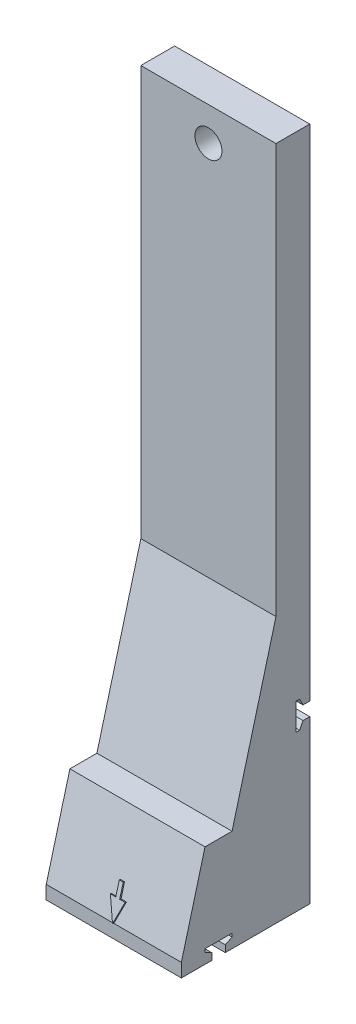
ISO-10303-21;
HEADER;
FILE_DESCRIPTION(('STEP AP214'),'2;1');
FILE_NAME('part.step','',(''),(''),'','','');
FILE_SCHEMA(('AUTOMOTIVE_DESIGN { 1 0 10303 214 1 1 1 1 }'));
ENDSEC;
DATA;
#1=APPLICATION_CONTEXT('core data for automotive mechanical design processes');
#2=APPLICATION_PROTOCOL_DEFINITION('international standard','automotive_design',2000,#1);
#3=PRODUCT_CONTEXT('',#1,'mechanical');
#4=PRODUCT('Part','Part','',(#3));
#5=PRODUCT_RELATED_PRODUCT_CATEGORY('part','',(#4));
#6=PRODUCT_DEFINITION_FORMATION('','',#4);
#7=PRODUCT_DEFINITION_CONTEXT('part definition',#1,'design');
#8=PRODUCT_DEFINITION('design','',#6,#7);
#9=PRODUCT_DEFINITION_SHAPE('','',#8);
#10=(LENGTH_UNIT() NAMED_UNIT(*) SI_UNIT(.MILLI.,.METRE.));
#11=(NAMED_UNIT(*) PLANE_ANGLE_UNIT() SI_UNIT($,.RADIAN.));
#12=(NAMED_UNIT(*) SI_UNIT($,.STERADIAN.) SOLID_ANGLE_UNIT());
#13=UNCERTAINTY_MEASURE_WITH_UNIT(LENGTH_MEASURE(1.E-05),#10,'distance_accuracy_value','');
#14=(GEOMETRIC_REPRESENTATION_CONTEXT(3) GLOBAL_UNCERTAINTY_ASSIGNED_CONTEXT((#13)) GLOBAL_UNIT_ASSIGNED_CONTEXT((#10,
#11,#12)) REPRESENTATION_CONTEXT('',''));
#15=CARTESIAN_POINT('',(0.,0.,0.));
#16=DIRECTION('',(0.,0.,1.));
#17=DIRECTION('',(1.,0.,0.));
#18=AXIS2_PLACEMENT_3D('',#15,#16,#17);
#19=CARTESIAN_POINT('',(1250.,60.,200.));
#20=DIRECTION('',(0.,-0.258819045102525,-0.965925826289067));
#21=DIRECTION('',(0.,0.965925826289067,-0.258819045102525));
#22=AXIS2_PLACEMENT_3D('',#19,#20,#21);
#23=PLANE('',#22);
#24=DIRECTION('',(0.342020143325665,0.907673371190369,-0.243210346801698));
#25=VECTOR('',#24,1.);
#26=CARTESIAN_POINT('',(1205.45955351399,74.488887394336,196.117714323462));
#27=LINE('',#26,#25);
#28=CARTESIAN_POINT('',(1200.,60.,200.));
#29=VERTEX_POINT('',#28);
#30=CARTESIAN_POINT('',(1205.45955351399,74.488887394336,196.117714323462));
#31=VERTEX_POINT('',#30);
#32=EDGE_CURVE('E261',#29,#31,#27,.T.);
#33=ORIENTED_EDGE('',*,*,#32,.F.);
#34=DIRECTION('',(-1.,0.,0.));
#35=VECTOR('',#34,1.);
#36=CARTESIAN_POINT('',(1250.,60.,200.));
#37=LINE('',#36,#35);
#38=CARTESIAN_POINT('',(1250.,60.,200.));
#39=VERTEX_POINT('',#38);
#40=EDGE_CURVE('E376',#39,#29,#37,.T.);
#41=ORIENTED_EDGE('',*,*,#40,.F.);
#42=DIRECTION('',(0.,-0.965925826289067,0.258819045102525));
#43=VECTOR('',#42,1.);
#44=CARTESIAN_POINT('',(1250.,60.,200.));
#45=LINE('',#44,#43);
#46=CARTESIAN_POINT('',(1250.,125.310889132454,182.5));
#47=VERTEX_POINT('',#46);
#48=EDGE_CURVE('E321',#47,#39,#45,.T.);
#49=ORIENTED_EDGE('',*,*,#48,.F.);
#50=DIRECTION('',(-1.,0.,0.));
#51=VECTOR('',#50,1.);
#52=CARTESIAN_POINT('',(1250.,125.310889132454,182.5));
#53=LINE('',#52,#51);
#54=CARTESIAN_POINT('',(1150.,125.310889132454,182.5));
#55=VERTEX_POINT('',#54);
#56=EDGE_CURVE('E378',#47,#55,#53,.T.);
#57=ORIENTED_EDGE('',*,*,#56,.T.);
#58=DIRECTION('',(0.,-0.965925826289067,0.258819045102525));
#59=VECTOR('',#58,1.);
#60=CARTESIAN_POINT('',(1150.,60.,200.));
#61=LINE('',#60,#59);
#62=CARTESIAN_POINT('',(1150.,60.,200.));
#63=VERTEX_POINT('',#62);
#64=EDGE_CURVE('E369',#55,#63,#61,.T.);
#65=ORIENTED_EDGE('',*,*,#64,.T.);
#66=EDGE_CURVE('E375',#29,#63,#37,.T.);
#67=ORIENTED_EDGE('',*,*,#66,.F.);
#68=DIRECTION('',(0.342020143325665,-0.907673371190369,0.243210346801698));
#69=VECTOR('',#68,1.);
#70=CARTESIAN_POINT('',(1200.,60.,200.));
#71=LINE('',#70,#69);
#72=CARTESIAN_POINT('',(1194.54044648601,74.4888873943358,196.117714323462));
#73=VERTEX_POINT('',#72);
#74=EDGE_CURVE('E258',#73,#29,#71,.T.);
#75=ORIENTED_EDGE('',*,*,#74,.F.);
#76=DIRECTION('',(-1.,0.,0.));
#77=VECTOR('',#76,1.);
#78=CARTESIAN_POINT('',(1194.54044648601,74.488887394336,196.117714323462));
#79=LINE('',#78,#77);
#80=CARTESIAN_POINT('',(1198.54044648601,74.488887394336,196.117714323462));
#81=VERTEX_POINT('',#80);
#82=EDGE_CURVE('E942',#81,#73,#79,.T.);
#83=ORIENTED_EDGE('',*,*,#82,.F.);
#84=DIRECTION('',(0.,-0.965925826289067,0.258819045102526));
#85=VECTOR('',#84,1.);
#86=CARTESIAN_POINT('',(1198.54044648601,74.488887394336,196.117714323462));
#87=LINE('',#86,#85);
#88=CARTESIAN_POINT('',(1198.54044648601,84.1481456572266,193.529523872437));
#89=VERTEX_POINT('',#88);
#90=EDGE_CURVE('E939',#89,#81,#87,.T.);
#91=ORIENTED_EDGE('',*,*,#90,.F.);
#92=DIRECTION('',(-1.,0.,0.));
#93=VECTOR('',#92,1.);
#94=CARTESIAN_POINT('',(1198.54044648601,84.1481456572267,193.529523872437));
#95=LINE('',#94,#93);
#96=CARTESIAN_POINT('',(1201.45955351399,84.1481456572267,193.529523872437));
#97=VERTEX_POINT('',#96);
#98=EDGE_CURVE('E936',#97,#89,#95,.T.);
#99=ORIENTED_EDGE('',*,*,#98,.F.);
#100=DIRECTION('',(0.,0.965925826289067,-0.258819045102526));
#101=VECTOR('',#100,1.);
#102=CARTESIAN_POINT('',(1201.45955351399,84.1481456572267,193.529523872437));
#103=LINE('',#102,#101);
#104=CARTESIAN_POINT('',(1201.45955351399,74.488887394336,196.117714323462));
#105=VERTEX_POINT('',#104);
#106=EDGE_CURVE('E58',#105,#97,#103,.T.);
#107=ORIENTED_EDGE('',*,*,#106,.F.);
#108=DIRECTION('',(-1.,0.,0.));
#109=VECTOR('',#108,1.);
#110=CARTESIAN_POINT('',(1201.45955351399,74.488887394336,196.117714323462));
#111=LINE('',#110,#109);
#112=EDGE_CURVE('E53',#31,#105,#111,.T.);
#113=ORIENTED_EDGE('',*,*,#112,.F.);
#114=EDGE_LOOP('',(#33,#41,#49,#57,#65,#67,#75,#83,#91,#99,#107,#113));
#115=FACE_BOUND('',#114,.T.);
#116=ADVANCED_FACE('F38',(#115),#23,.F.);
#117=CARTESIAN_POINT('',(1250.,50.,177.5));
#118=DIRECTION('',(0.,1.,0.));
#119=DIRECTION('',(0.,0.,1.));
#120=AXIS2_PLACEMENT_3D('',#117,#118,#119);
#121=PLANE('',#120);
#122=DIRECTION('',(0.,0.,-1.));
#123=VECTOR('',#122,1.);
#124=CARTESIAN_POINT('',(1150.,50.,177.5));
#125=LINE('',#124,#123);
#126=CARTESIAN_POINT('',(1150.,50.,200.));
#127=VERTEX_POINT('',#126);
#128=CARTESIAN_POINT('',(1150.,50.,177.5));
#129=VERTEX_POINT('',#128);
#130=EDGE_CURVE('E275',#127,#129,#125,.T.);
#131=ORIENTED_EDGE('',*,*,#130,.T.);
#132=DIRECTION('',(-1.,0.,0.));
#133=VECTOR('',#132,1.);
#134=CARTESIAN_POINT('',(1250.,50.,177.5));
#135=LINE('',#134,#133);
#136=CARTESIAN_POINT('',(1250.,50.,177.5));
#137=VERTEX_POINT('',#136);
#138=EDGE_CURVE('E46',#137,#129,#135,.T.);
#139=ORIENTED_EDGE('',*,*,#138,.F.);
#140=DIRECTION('',(0.,0.,-1.));
#141=VECTOR('',#140,1.);
#142=CARTESIAN_POINT('',(1250.,50.,177.5));
#143=LINE('',#142,#141);
#144=CARTESIAN_POINT('',(1250.,50.,200.));
#145=VERTEX_POINT('',#144);
#146=EDGE_CURVE('E276',#145,#137,#143,.T.);
#147=ORIENTED_EDGE('',*,*,#146,.F.);
#148=DIRECTION('',(-1.,0.,0.));
#149=VECTOR('',#148,1.);
#150=CARTESIAN_POINT('',(1250.,50.,200.));
#151=LINE('',#150,#149);
#152=EDGE_CURVE('E325',#145,#127,#151,.T.);
#153=ORIENTED_EDGE('',*,*,#152,.T.);
#154=EDGE_LOOP('',(#131,#139,#147,#153));
#155=FACE_BOUND('',#154,.T.);
#156=ADVANCED_FACE('F40',(#155),#121,.F.);
#157=CARTESIAN_POINT('',(1250.,55.,177.5));
#158=DIRECTION('',(0.,0.,1.));
#159=DIRECTION('',(1.,0.,0.));
#160=AXIS2_PLACEMENT_3D('',#157,#158,#159);
#161=PLANE('',#160);
#162=DIRECTION('',(0.,1.,0.));
#163=VECTOR('',#162,1.);
#164=CARTESIAN_POINT('',(1150.,55.,177.5));
#165=LINE('',#164,#163);
#166=CARTESIAN_POINT('',(1150.,55.,177.5));
#167=VERTEX_POINT('',#166);
#168=EDGE_CURVE('E328',#129,#167,#165,.T.);
#169=ORIENTED_EDGE('',*,*,#168,.T.);
#170=DIRECTION('',(-1.,0.,0.));
#171=VECTOR('',#170,1.);
#172=CARTESIAN_POINT('',(1250.,55.,177.5));
#173=LINE('',#172,#171);
#174=CARTESIAN_POINT('',(1250.,55.,177.5));
#175=VERTEX_POINT('',#174);
#176=EDGE_CURVE('E432',#175,#167,#173,.T.);
#177=ORIENTED_EDGE('',*,*,#176,.F.);
#178=DIRECTION('',(0.,1.,0.));
#179=VECTOR('',#178,1.);
#180=CARTESIAN_POINT('',(1250.,55.,177.5));
#181=LINE('',#180,#179);
#182=EDGE_CURVE('E279',#137,#175,#181,.T.);
#183=ORIENTED_EDGE('',*,*,#182,.F.);
#184=ORIENTED_EDGE('',*,*,#138,.T.);
#185=EDGE_LOOP('',(#169,#177,#183,#184));
#186=FACE_BOUND('',#185,.T.);
#187=ADVANCED_FACE('F437',(#186),#161,.F.);
#188=CARTESIAN_POINT('',(1250.,57.5,182.5));
#189=DIRECTION('',(0.,-0.894427190999916,0.447213595499958));
#190=DIRECTION('',(0.,-0.447213595499958,-0.894427190999916));
#191=AXIS2_PLACEMENT_3D('',#188,#189,#190);
#192=PLANE('',#191);
#193=DIRECTION('',(0.,0.447213595499958,0.894427190999916));
#194=VECTOR('',#193,1.);
#195=CARTESIAN_POINT('',(1150.,57.5,182.5));
#196=LINE('',#195,#194);
#197=CARTESIAN_POINT('',(1150.,57.5,182.5));
#198=VERTEX_POINT('',#197);
#199=EDGE_CURVE('E330',#167,#198,#196,.T.);
#200=ORIENTED_EDGE('',*,*,#199,.T.);
#201=DIRECTION('',(-1.,0.,0.));
#202=VECTOR('',#201,1.);
#203=CARTESIAN_POINT('',(1250.,57.5,182.5));
#204=LINE('',#203,#202);
#205=CARTESIAN_POINT('',(1250.,57.5,182.5));
#206=VERTEX_POINT('',#205);
#207=EDGE_CURVE('E429',#206,#198,#204,.T.);
#208=ORIENTED_EDGE('',*,*,#207,.F.);
#209=DIRECTION('',(0.,0.447213595499958,0.894427190999916));
#210=VECTOR('',#209,1.);
#211=CARTESIAN_POINT('',(1250.,57.5,182.5));
#212=LINE('',#211,#210);
#213=EDGE_CURVE('E282',#175,#206,#212,.T.);
#214=ORIENTED_EDGE('',*,*,#213,.F.);
#215=ORIENTED_EDGE('',*,*,#176,.T.);
#216=EDGE_LOOP('',(#200,#208,#214,#215));
#217=FACE_BOUND('',#216,.T.);
#218=ADVANCED_FACE('F453',(#217),#192,.F.);
#219=CARTESIAN_POINT('',(1250.,60.,182.5));
#220=DIRECTION('',(0.,0.,1.));
#221=DIRECTION('',(1.,0.,0.));
#222=AXIS2_PLACEMENT_3D('',#219,#220,#221);
#223=PLANE('',#222);
#224=DIRECTION('',(0.,1.,0.));
#225=VECTOR('',#224,1.);
#226=CARTESIAN_POINT('',(1150.,60.,182.5));
#227=LINE('',#226,#225);
#228=CARTESIAN_POINT('',(1150.,60.,182.5));
#229=VERTEX_POINT('',#228);
#230=EDGE_CURVE('E332',#198,#229,#227,.T.);
#231=ORIENTED_EDGE('',*,*,#230,.T.);
#232=DIRECTION('',(-1.,0.,0.));
#233=VECTOR('',#232,1.);
#234=CARTESIAN_POINT('',(1250.,60.,182.5));
#235=LINE('',#234,#233);
#236=CARTESIAN_POINT('',(1250.,60.,182.5));
#237=VERTEX_POINT('',#236);
#238=EDGE_CURVE('E426',#237,#229,#235,.T.);
#239=ORIENTED_EDGE('',*,*,#238,.F.);
#240=DIRECTION('',(0.,1.,0.));
#241=VECTOR('',#240,1.);
#242=CARTESIAN_POINT('',(1250.,60.,182.5));
#243=LINE('',#242,#241);
#244=EDGE_CURVE('E284',#206,#237,#243,.T.);
#245=ORIENTED_EDGE('',*,*,#244,.F.);
#246=ORIENTED_EDGE('',*,*,#207,.T.);
#247=EDGE_LOOP('',(#231,#239,#245,#246));
#248=FACE_BOUND('',#247,.T.);
#249=ADVANCED_FACE('F457',(#248),#223,.F.);
#250=CARTESIAN_POINT('',(1250.,60.,162.5));
#251=DIRECTION('',(0.,1.,0.));
#252=DIRECTION('',(0.,0.,1.));
#253=AXIS2_PLACEMENT_3D('',#250,#251,#252);
#254=PLANE('',#253);
#255=DIRECTION('',(0.,0.,-1.));
#256=VECTOR('',#255,1.);
#257=CARTESIAN_POINT('',(1150.,60.,162.5));
#258=LINE('',#257,#256);
#259=CARTESIAN_POINT('',(1150.,60.,162.5));
#260=VERTEX_POINT('',#259);
#261=EDGE_CURVE('E334',#229,#260,#258,.T.);
#262=ORIENTED_EDGE('',*,*,#261,.T.);
#263=DIRECTION('',(-1.,0.,0.));
#264=VECTOR('',#263,1.);
#265=CARTESIAN_POINT('',(1250.,60.,162.5));
#266=LINE('',#265,#264);
#267=CARTESIAN_POINT('',(1250.,60.,162.5));
#268=VERTEX_POINT('',#267);
#269=EDGE_CURVE('E423',#268,#260,#266,.T.);
#270=ORIENTED_EDGE('',*,*,#269,.F.);
#271=DIRECTION('',(0.,0.,-1.));
#272=VECTOR('',#271,1.);
#273=CARTESIAN_POINT('',(1250.,60.,162.5));
#274=LINE('',#273,#272);
#275=EDGE_CURVE('E286',#237,#268,#274,.T.);
#276=ORIENTED_EDGE('',*,*,#275,.F.);
#277=ORIENTED_EDGE('',*,*,#238,.T.);
#278=EDGE_LOOP('',(#262,#270,#276,#277));
#279=FACE_BOUND('',#278,.T.);
#280=ADVANCED_FACE('F550',(#279),#254,.F.);
#281=CARTESIAN_POINT('',(1250.,57.5,162.5));
#282=DIRECTION('',(0.,0.,-1.));
#283=DIRECTION('',(-1.,0.,0.));
#284=AXIS2_PLACEMENT_3D('',#281,#282,#283);
#285=PLANE('',#284);
#286=DIRECTION('',(0.,-1.,0.));
#287=VECTOR('',#286,1.);
#288=CARTESIAN_POINT('',(1150.,57.5,162.5));
#289=LINE('',#288,#287);
#290=CARTESIAN_POINT('',(1150.,57.5,162.5));
#291=VERTEX_POINT('',#290);
#292=EDGE_CURVE('E336',#260,#291,#289,.T.);
#293=ORIENTED_EDGE('',*,*,#292,.T.);
#294=DIRECTION('',(-1.,0.,0.));
#295=VECTOR('',#294,1.);
#296=CARTESIAN_POINT('',(1250.,57.5,162.5));
#297=LINE('',#296,#295);
#298=CARTESIAN_POINT('',(1250.,57.5,162.5));
#299=VERTEX_POINT('',#298);
#300=EDGE_CURVE('E420',#299,#291,#297,.T.);
#301=ORIENTED_EDGE('',*,*,#300,.F.);
#302=DIRECTION('',(0.,-1.,0.));
#303=VECTOR('',#302,1.);
#304=CARTESIAN_POINT('',(1250.,57.5,162.5));
#305=LINE('',#304,#303);
#306=EDGE_CURVE('E288',#268,#299,#305,.T.);
#307=ORIENTED_EDGE('',*,*,#306,.F.);
#308=ORIENTED_EDGE('',*,*,#269,.T.);
#309=EDGE_LOOP('',(#293,#301,#307,#308));
#310=FACE_BOUND('',#309,.T.);
#311=ADVANCED_FACE('F548',(#310),#285,.F.);
#312=CARTESIAN_POINT('',(1250.,55.,167.5));
#313=DIRECTION('',(0.,-0.894427190999916,-0.447213595499957));
#314=DIRECTION('',(0.,0.447213595499957,-0.894427190999916));
#315=AXIS2_PLACEMENT_3D('',#312,#313,#314);
#316=PLANE('',#315);
#317=DIRECTION('',(0.,-0.447213595499957,0.894427190999916));
#318=VECTOR('',#317,1.);
#319=CARTESIAN_POINT('',(1150.,55.,167.5));
#320=LINE('',#319,#318);
#321=CARTESIAN_POINT('',(1150.,55.,167.5));
#322=VERTEX_POINT('',#321);
#323=EDGE_CURVE('E338',#291,#322,#320,.T.);
#324=ORIENTED_EDGE('',*,*,#323,.T.);
#325=DIRECTION('',(-1.,0.,0.));
#326=VECTOR('',#325,1.);
#327=CARTESIAN_POINT('',(1250.,55.,167.5));
#328=LINE('',#327,#326);
#329=CARTESIAN_POINT('',(1250.,55.,167.5));
#330=VERTEX_POINT('',#329);
#331=EDGE_CURVE('E417',#330,#322,#328,.T.);
#332=ORIENTED_EDGE('',*,*,#331,.F.);
#333=DIRECTION('',(0.,-0.447213595499957,0.894427190999916));
#334=VECTOR('',#333,1.);
#335=CARTESIAN_POINT('',(1250.,55.,167.5));
#336=LINE('',#335,#334);
#337=EDGE_CURVE('E290',#299,#330,#336,.T.);
#338=ORIENTED_EDGE('',*,*,#337,.F.);
#339=ORIENTED_EDGE('',*,*,#300,.T.);
#340=EDGE_LOOP('',(#324,#332,#338,#339));
#341=FACE_BOUND('',#340,.T.);
#342=ADVANCED_FACE('F543',(#341),#316,.F.);
#343=CARTESIAN_POINT('',(1250.,50.,167.5));
#344=DIRECTION('',(0.,0.,-1.));
#345=DIRECTION('',(-1.,0.,0.));
#346=AXIS2_PLACEMENT_3D('',#343,#344,#345);
#347=PLANE('',#346);
#348=DIRECTION('',(0.,-1.,0.));
#349=VECTOR('',#348,1.);
#350=CARTESIAN_POINT('',(1150.,50.,167.5));
#351=LINE('',#350,#349);
#352=CARTESIAN_POINT('',(1150.,50.,167.5));
#353=VERTEX_POINT('',#352);
#354=EDGE_CURVE('E340',#322,#353,#351,.T.);
#355=ORIENTED_EDGE('',*,*,#354,.T.);
#356=DIRECTION('',(-1.,0.,0.));
#357=VECTOR('',#356,1.);
#358=CARTESIAN_POINT('',(1250.,50.,167.5));
#359=LINE('',#358,#357);
#360=CARTESIAN_POINT('',(1250.,50.,167.5));
#361=VERTEX_POINT('',#360);
#362=EDGE_CURVE('E414',#361,#353,#359,.T.);
#363=ORIENTED_EDGE('',*,*,#362,.F.);
#364=DIRECTION('',(0.,-1.,0.));
#365=VECTOR('',#364,1.);
#366=CARTESIAN_POINT('',(1250.,50.,167.5));
#367=LINE('',#366,#365);
#368=EDGE_CURVE('E292',#330,#361,#367,.T.);
#369=ORIENTED_EDGE('',*,*,#368,.F.);
#370=ORIENTED_EDGE('',*,*,#331,.T.);
#371=EDGE_LOOP('',(#355,#363,#369,#370));
#372=FACE_BOUND('',#371,.T.);
#373=ADVANCED_FACE('F538',(#372),#347,.F.);
#374=CARTESIAN_POINT('',(1250.,50.,105.));
#375=DIRECTION('',(0.,1.,0.));
#376=DIRECTION('',(0.,0.,1.));
#377=AXIS2_PLACEMENT_3D('',#374,#375,#376);
#378=PLANE('',#377);
#379=DIRECTION('',(0.,0.,-1.));
#380=VECTOR('',#379,1.);
#381=CARTESIAN_POINT('',(1150.,50.,105.));
#382=LINE('',#381,#380);
#383=CARTESIAN_POINT('',(1150.,50.,105.));
#384=VERTEX_POINT('',#383);
#385=EDGE_CURVE('E342',#353,#384,#382,.T.);
#386=ORIENTED_EDGE('',*,*,#385,.T.);
#387=DIRECTION('',(-1.,0.,0.));
#388=VECTOR('',#387,1.);
#389=CARTESIAN_POINT('',(1250.,50.,105.));
#390=LINE('',#389,#388);
#391=CARTESIAN_POINT('',(1250.,50.,105.));
#392=VERTEX_POINT('',#391);
#393=EDGE_CURVE('E411',#392,#384,#390,.T.);
#394=ORIENTED_EDGE('',*,*,#393,.F.);
#395=DIRECTION('',(0.,0.,-1.));
#396=VECTOR('',#395,1.);
#397=CARTESIAN_POINT('',(1250.,50.,105.));
#398=LINE('',#397,#396);
#399=EDGE_CURVE('E294',#361,#392,#398,.T.);
#400=ORIENTED_EDGE('',*,*,#399,.F.);
#401=ORIENTED_EDGE('',*,*,#362,.T.);
#402=EDGE_LOOP('',(#386,#394,#400,#401));
#403=FACE_BOUND('',#402,.T.);
#404=ADVANCED_FACE('F534',(#403),#378,.F.);
#405=CARTESIAN_POINT('',(1250.,170.,105.));
#406=DIRECTION('',(0.,0.,1.));
#407=DIRECTION('',(1.,0.,0.));
#408=AXIS2_PLACEMENT_3D('',#405,#406,#407);
#409=PLANE('',#408);
#410=DIRECTION('',(0.,1.,0.));
#411=VECTOR('',#410,1.);
#412=CARTESIAN_POINT('',(1150.,170.,105.));
#413=LINE('',#412,#411);
#414=CARTESIAN_POINT('',(1150.,170.,105.));
#415=VERTEX_POINT('',#414);
#416=EDGE_CURVE('E344',#384,#415,#413,.T.);
#417=ORIENTED_EDGE('',*,*,#416,.T.);
#418=DIRECTION('',(-1.,0.,0.));
#419=VECTOR('',#418,1.);
#420=CARTESIAN_POINT('',(1250.,170.,105.));
#421=LINE('',#420,#419);
#422=CARTESIAN_POINT('',(1250.,170.,105.));
#423=VERTEX_POINT('',#422);
#424=EDGE_CURVE('E408',#423,#415,#421,.T.);
#425=ORIENTED_EDGE('',*,*,#424,.F.);
#426=DIRECTION('',(0.,1.,0.));
#427=VECTOR('',#426,1.);
#428=CARTESIAN_POINT('',(1250.,170.,105.));
#429=LINE('',#428,#427);
#430=EDGE_CURVE('E296',#392,#423,#429,.T.);
#431=ORIENTED_EDGE('',*,*,#430,.F.);
#432=ORIENTED_EDGE('',*,*,#393,.T.);
#433=EDGE_LOOP('',(#417,#425,#431,#432));
#434=FACE_BOUND('',#433,.T.);
#435=ADVANCED_FACE('F529',(#434),#409,.F.);
#436=CARTESIAN_POINT('',(1250.,170.,110.));
#437=DIRECTION('',(0.,-1.,0.));
#438=DIRECTION('',(0.,0.,-1.));
#439=AXIS2_PLACEMENT_3D('',#436,#437,#438);
#440=PLANE('',#439);
#441=DIRECTION('',(0.,0.,1.));
#442=VECTOR('',#441,1.);
#443=CARTESIAN_POINT('',(1150.,170.,110.));
#444=LINE('',#443,#442);
#445=CARTESIAN_POINT('',(1150.,170.,110.));
#446=VERTEX_POINT('',#445);
#447=EDGE_CURVE('E346',#415,#446,#444,.T.);
#448=ORIENTED_EDGE('',*,*,#447,.T.);
#449=DIRECTION('',(-1.,0.,0.));
#450=VECTOR('',#449,1.);
#451=CARTESIAN_POINT('',(1250.,170.,110.));
#452=LINE('',#451,#450);
#453=CARTESIAN_POINT('',(1250.,170.,110.));
#454=VERTEX_POINT('',#453);
#455=EDGE_CURVE('E405',#454,#446,#452,.T.);
#456=ORIENTED_EDGE('',*,*,#455,.F.);
#457=DIRECTION('',(0.,0.,1.));
#458=VECTOR('',#457,1.);
#459=CARTESIAN_POINT('',(1250.,170.,110.));
#460=LINE('',#459,#458);
#461=EDGE_CURVE('E298',#423,#454,#460,.T.);
#462=ORIENTED_EDGE('',*,*,#461,.F.);
#463=ORIENTED_EDGE('',*,*,#424,.T.);
#464=EDGE_LOOP('',(#448,#456,#462,#463));
#465=FACE_BOUND('',#464,.T.);
#466=ADVANCED_FACE('F523',(#465),#440,.F.);
#467=CARTESIAN_POINT('',(1250.,165.,112.5));
#468=DIRECTION('',(0.,-0.44721359549996,-0.894427190999915));
#469=DIRECTION('',(0.,0.894427190999915,-0.44721359549996));
#470=AXIS2_PLACEMENT_3D('',#467,#468,#469);
#471=PLANE('',#470);
#472=DIRECTION('',(0.,-0.894427190999915,0.44721359549996));
#473=VECTOR('',#472,1.);
#474=CARTESIAN_POINT('',(1150.,165.,112.5));
#475=LINE('',#474,#473);
#476=CARTESIAN_POINT('',(1150.,165.,112.5));
#477=VERTEX_POINT('',#476);
#478=EDGE_CURVE('E348',#446,#477,#475,.T.);
#479=ORIENTED_EDGE('',*,*,#478,.T.);
#480=DIRECTION('',(-1.,0.,0.));
#481=VECTOR('',#480,1.);
#482=CARTESIAN_POINT('',(1250.,165.,112.5));
#483=LINE('',#482,#481);
#484=CARTESIAN_POINT('',(1250.,165.,112.5));
#485=VERTEX_POINT('',#484);
#486=EDGE_CURVE('E402',#485,#477,#483,.T.);
#487=ORIENTED_EDGE('',*,*,#486,.F.);
#488=DIRECTION('',(0.,-0.894427190999915,0.44721359549996));
#489=VECTOR('',#488,1.);
#490=CARTESIAN_POINT('',(1250.,165.,112.5));
#491=LINE('',#490,#489);
#492=EDGE_CURVE('E300',#454,#485,#491,.T.);
#493=ORIENTED_EDGE('',*,*,#492,.F.);
#494=ORIENTED_EDGE('',*,*,#455,.T.);
#495=EDGE_LOOP('',(#479,#487,#493,#494));
#496=FACE_BOUND('',#495,.T.);
#497=ADVANCED_FACE('F519',(#496),#471,.F.);
#498=CARTESIAN_POINT('',(1250.,165.,115.));
#499=DIRECTION('',(0.,-1.,0.));
#500=DIRECTION('',(0.,0.,-1.));
#501=AXIS2_PLACEMENT_3D('',#498,#499,#500);
#502=PLANE('',#501);
#503=DIRECTION('',(0.,0.,1.));
#504=VECTOR('',#503,1.);
#505=CARTESIAN_POINT('',(1150.,165.,115.));
#506=LINE('',#505,#504);
#507=CARTESIAN_POINT('',(1150.,165.,115.));
#508=VERTEX_POINT('',#507);
#509=EDGE_CURVE('E350',#477,#508,#506,.T.);
#510=ORIENTED_EDGE('',*,*,#509,.T.);
#511=DIRECTION('',(-1.,0.,0.));
#512=VECTOR('',#511,1.);
#513=CARTESIAN_POINT('',(1250.,165.,115.));
#514=LINE('',#513,#512);
#515=CARTESIAN_POINT('',(1250.,165.,115.));
#516=VERTEX_POINT('',#515);
#517=EDGE_CURVE('E399',#516,#508,#514,.T.);
#518=ORIENTED_EDGE('',*,*,#517,.F.);
#519=DIRECTION('',(0.,0.,1.));
#520=VECTOR('',#519,1.);
#521=CARTESIAN_POINT('',(1250.,165.,115.));
#522=LINE('',#521,#520);
#523=EDGE_CURVE('E302',#485,#516,#522,.T.);
#524=ORIENTED_EDGE('',*,*,#523,.F.);
#525=ORIENTED_EDGE('',*,*,#486,.T.);
#526=EDGE_LOOP('',(#510,#518,#524,#525));
#527=FACE_BOUND('',#526,.T.);
#528=ADVANCED_FACE('F514',(#527),#502,.F.);
#529=CARTESIAN_POINT('',(1250.,185.,115.));
#530=DIRECTION('',(0.,0.,1.));
#531=DIRECTION('',(1.,0.,0.));
#532=AXIS2_PLACEMENT_3D('',#529,#530,#531);
#533=PLANE('',#532);
#534=DIRECTION('',(0.,1.,0.));
#535=VECTOR('',#534,1.);
#536=CARTESIAN_POINT('',(1150.,185.,115.));
#537=LINE('',#536,#535);
#538=CARTESIAN_POINT('',(1150.,185.,115.));
#539=VERTEX_POINT('',#538);
#540=EDGE_CURVE('E352',#508,#539,#537,.T.);
#541=ORIENTED_EDGE('',*,*,#540,.T.);
#542=DIRECTION('',(-1.,0.,0.));
#543=VECTOR('',#542,1.);
#544=CARTESIAN_POINT('',(1250.,185.,115.));
#545=LINE('',#544,#543);
#546=CARTESIAN_POINT('',(1250.,185.,115.));
#547=VERTEX_POINT('',#546);
#548=EDGE_CURVE('E396',#547,#539,#545,.T.);
#549=ORIENTED_EDGE('',*,*,#548,.F.);
#550=DIRECTION('',(0.,1.,0.));
#551=VECTOR('',#550,1.);
#552=CARTESIAN_POINT('',(1250.,185.,115.));
#553=LINE('',#552,#551);
#554=EDGE_CURVE('E304',#516,#547,#553,.T.);
#555=ORIENTED_EDGE('',*,*,#554,.F.);
#556=ORIENTED_EDGE('',*,*,#517,.T.);
#557=EDGE_LOOP('',(#541,#549,#555,#556));
#558=FACE_BOUND('',#557,.T.);
#559=ADVANCED_FACE('F508',(#558),#533,.F.);
#560=CARTESIAN_POINT('',(1250.,185.,112.5));
#561=DIRECTION('',(0.,1.,0.));
#562=DIRECTION('',(0.,0.,1.));
#563=AXIS2_PLACEMENT_3D('',#560,#561,#562);
#564=PLANE('',#563);
#565=DIRECTION('',(0.,0.,-1.));
#566=VECTOR('',#565,1.);
#567=CARTESIAN_POINT('',(1150.,185.,112.5));
#568=LINE('',#567,#566);
#569=CARTESIAN_POINT('',(1150.,185.,112.5));
#570=VERTEX_POINT('',#569);
#571=EDGE_CURVE('E354',#539,#570,#568,.T.);
#572=ORIENTED_EDGE('',*,*,#571,.T.);
#573=DIRECTION('',(-1.,0.,0.));
#574=VECTOR('',#573,1.);
#575=CARTESIAN_POINT('',(1250.,185.,112.5));
#576=LINE('',#575,#574);
#577=CARTESIAN_POINT('',(1250.,185.,112.5));
#578=VERTEX_POINT('',#577);
#579=EDGE_CURVE('E393',#578,#570,#576,.T.);
#580=ORIENTED_EDGE('',*,*,#579,.F.);
#581=DIRECTION('',(0.,0.,-1.));
#582=VECTOR('',#581,1.);
#583=CARTESIAN_POINT('',(1250.,185.,112.5));
#584=LINE('',#583,#582);
#585=EDGE_CURVE('E306',#547,#578,#584,.T.);
#586=ORIENTED_EDGE('',*,*,#585,.F.);
#587=ORIENTED_EDGE('',*,*,#548,.T.);
#588=EDGE_LOOP('',(#572,#580,#586,#587));
#589=FACE_BOUND('',#588,.T.);
#590=ADVANCED_FACE('F504',(#589),#564,.F.);
#591=CARTESIAN_POINT('',(1250.,180.,110.));
#592=DIRECTION('',(0.,0.447213595499956,-0.894427190999917));
#593=DIRECTION('',(0.,0.894427190999917,0.447213595499956));
#594=AXIS2_PLACEMENT_3D('',#591,#592,#593);
#595=PLANE('',#594);
#596=DIRECTION('',(0.,-0.894427190999917,-0.447213595499956));
#597=VECTOR('',#596,1.);
#598=CARTESIAN_POINT('',(1150.,180.,110.));
#599=LINE('',#598,#597);
#600=CARTESIAN_POINT('',(1150.,180.,110.));
#601=VERTEX_POINT('',#600);
#602=EDGE_CURVE('E356',#570,#601,#599,.T.);
#603=ORIENTED_EDGE('',*,*,#602,.T.);
#604=DIRECTION('',(-1.,0.,0.));
#605=VECTOR('',#604,1.);
#606=CARTESIAN_POINT('',(1250.,180.,110.));
#607=LINE('',#606,#605);
#608=CARTESIAN_POINT('',(1250.,180.,110.));
#609=VERTEX_POINT('',#608);
#610=EDGE_CURVE('E390',#609,#601,#607,.T.);
#611=ORIENTED_EDGE('',*,*,#610,.F.);
#612=DIRECTION('',(0.,-0.894427190999917,-0.447213595499956));
#613=VECTOR('',#612,1.);
#614=CARTESIAN_POINT('',(1250.,180.,110.));
#615=LINE('',#614,#613);
#616=EDGE_CURVE('E308',#578,#609,#615,.T.);
#617=ORIENTED_EDGE('',*,*,#616,.F.);
#618=ORIENTED_EDGE('',*,*,#579,.T.);
#619=EDGE_LOOP('',(#603,#611,#617,#618));
#620=FACE_BOUND('',#619,.T.);
#621=ADVANCED_FACE('F499',(#620),#595,.F.);
#622=CARTESIAN_POINT('',(1250.,180.,105.));
#623=DIRECTION('',(0.,1.,0.));
#624=DIRECTION('',(0.,0.,1.));
#625=AXIS2_PLACEMENT_3D('',#622,#623,#624);
#626=PLANE('',#625);
#627=DIRECTION('',(0.,0.,-1.));
#628=VECTOR('',#627,1.);
#629=CARTESIAN_POINT('',(1150.,180.,105.));
#630=LINE('',#629,#628);
#631=CARTESIAN_POINT('',(1150.,180.,105.));
#632=VERTEX_POINT('',#631);
#633=EDGE_CURVE('E358',#601,#632,#630,.T.);
#634=ORIENTED_EDGE('',*,*,#633,.T.);
#635=DIRECTION('',(-1.,0.,0.));
#636=VECTOR('',#635,1.);
#637=CARTESIAN_POINT('',(1250.,180.,105.));
#638=LINE('',#637,#636);
#639=CARTESIAN_POINT('',(1250.,180.,105.));
#640=VERTEX_POINT('',#639);
#641=EDGE_CURVE('E387',#640,#632,#638,.T.);
#642=ORIENTED_EDGE('',*,*,#641,.F.);
#643=DIRECTION('',(0.,0.,-1.));
#644=VECTOR('',#643,1.);
#645=CARTESIAN_POINT('',(1250.,180.,105.));
#646=LINE('',#645,#644);
#647=EDGE_CURVE('E310',#609,#640,#646,.T.);
#648=ORIENTED_EDGE('',*,*,#647,.F.);
#649=ORIENTED_EDGE('',*,*,#610,.T.);
#650=EDGE_LOOP('',(#634,#642,#648,#649));
#651=FACE_BOUND('',#650,.T.);
#652=ADVANCED_FACE('F493',(#651),#626,.F.);
#653=CARTESIAN_POINT('',(1250.,816.139219029596,105.));
#654=DIRECTION('',(0.,0.,1.));
#655=DIRECTION('',(0.,-1.,0.));
#656=AXIS2_PLACEMENT_3D('',#653,#654,#655);
#657=PLANE('',#656);
#658=CARTESIAN_POINT('',(1200.,524.881308717651,105.));
#659=DIRECTION('',(0.,0.,1.));
#660=DIRECTION('',(0.,-1.,0.));
#661=AXIS2_PLACEMENT_3D('',#658,#659,#660);
#662=CIRCLE('',#661,10.0000000000001);
#663=CARTESIAN_POINT('',(1200.,514.881308717651,105.));
#664=VERTEX_POINT('',#663);
#665=EDGE_CURVE('E920',#664,#664,#662,.T.);
#666=ORIENTED_EDGE('',*,*,#665,.T.);
#667=EDGE_LOOP('',(#666));
#668=FACE_BOUND('',#667,.T.);
#669=DIRECTION('',(0.,1.,0.));
#670=VECTOR('',#669,1.);
#671=CARTESIAN_POINT('',(1150.,816.139219029596,105.));
#672=LINE('',#671,#670);
#673=CARTESIAN_POINT('',(1150.,549.762617435303,105.));
#674=VERTEX_POINT('',#673);
#675=EDGE_CURVE('E360',#632,#674,#672,.T.);
#676=ORIENTED_EDGE('',*,*,#675,.T.);
#677=DIRECTION('',(1.,0.,0.));
#678=VECTOR('',#677,1.);
#679=CARTESIAN_POINT('',(1250.,549.762617435303,105.));
#680=LINE('',#679,#678);
#681=CARTESIAN_POINT('',(1250.,549.762617435303,105.));
#682=VERTEX_POINT('',#681);
#683=EDGE_CURVE('E272',#674,#682,#680,.T.);
#684=ORIENTED_EDGE('',*,*,#683,.T.);
#685=DIRECTION('',(0.,1.,0.));
#686=VECTOR('',#685,1.);
#687=CARTESIAN_POINT('',(1250.,816.139219029596,105.));
#688=LINE('',#687,#686);
#689=EDGE_CURVE('E312',#640,#682,#688,.T.);
#690=ORIENTED_EDGE('',*,*,#689,.F.);
#691=ORIENTED_EDGE('',*,*,#641,.T.);
#692=EDGE_LOOP('',(#676,#684,#690,#691));
#693=FACE_BOUND('',#692,.T.);
#694=ADVANCED_FACE('F488',(#668,#693),#657,.F.);
#695=CARTESIAN_POINT('',(1250.,246.602540378441,130.));
#696=DIRECTION('',(0.,0.,-1.));
#697=DIRECTION('',(-1.,0.,0.));
#698=AXIS2_PLACEMENT_3D('',#695,#696,#697);
#699=PLANE('',#698);
#700=CARTESIAN_POINT('',(1200.,524.881308717651,130.));
#701=DIRECTION('',(0.,0.,1.));
#702=DIRECTION('',(1.,0.,0.));
#703=AXIS2_PLACEMENT_3D('',#700,#701,#702);
#704=CIRCLE('',#703,10.0000000000001);
#705=CARTESIAN_POINT('',(1210.,524.881308717651,130.));
#706=VERTEX_POINT('',#705);
#707=EDGE_CURVE('E917',#706,#706,#704,.T.);
#708=ORIENTED_EDGE('',*,*,#707,.F.);
#709=EDGE_LOOP('',(#708));
#710=FACE_BOUND('',#709,.T.);
#711=DIRECTION('',(0.,-1.,0.));
#712=VECTOR('',#711,1.);
#713=CARTESIAN_POINT('',(1250.,246.602540378441,130.));
#714=LINE('',#713,#712);
#715=CARTESIAN_POINT('',(1250.,549.762617435303,130.));
#716=VERTEX_POINT('',#715);
#717=CARTESIAN_POINT('',(1250.,246.602540378441,130.));
#718=VERTEX_POINT('',#717);
#719=EDGE_CURVE('E315',#716,#718,#714,.T.);
#720=ORIENTED_EDGE('',*,*,#719,.F.);
#721=DIRECTION('',(-1.,0.,0.));
#722=VECTOR('',#721,1.);
#723=CARTESIAN_POINT('',(1250.,549.762617435303,130.));
#724=LINE('',#723,#722);
#725=CARTESIAN_POINT('',(1150.,549.762617435303,130.));
#726=VERTEX_POINT('',#725);
#727=EDGE_CURVE('E264',#716,#726,#724,.T.);
#728=ORIENTED_EDGE('',*,*,#727,.T.);
#729=DIRECTION('',(0.,-1.,0.));
#730=VECTOR('',#729,1.);
#731=CARTESIAN_POINT('',(1150.,246.602540378441,130.));
#732=LINE('',#731,#730);
#733=CARTESIAN_POINT('',(1150.,246.602540378441,130.));
#734=VERTEX_POINT('',#733);
#735=EDGE_CURVE('E363',#726,#734,#732,.T.);
#736=ORIENTED_EDGE('',*,*,#735,.T.);
#737=DIRECTION('',(-1.,0.,0.));
#738=VECTOR('',#737,1.);
#739=CARTESIAN_POINT('',(1250.,246.602540378441,130.));
#740=LINE('',#739,#738);
#741=EDGE_CURVE('E384',#718,#734,#740,.T.);
#742=ORIENTED_EDGE('',*,*,#741,.F.);
#743=EDGE_LOOP('',(#720,#728,#736,#742));
#744=FACE_BOUND('',#743,.T.);
#745=ADVANCED_FACE('F483',(#710,#744),#699,.F.);
#746=CARTESIAN_POINT('',(1250.,125.310889132454,162.5));
#747=DIRECTION('',(0.,-0.258819045102525,-0.965925826289067));
#748=DIRECTION('',(0.,0.965925826289067,-0.258819045102525));
#749=AXIS2_PLACEMENT_3D('',#746,#747,#748);
#750=PLANE('',#749);
#751=DIRECTION('',(0.,-0.965925826289067,0.258819045102525));
#752=VECTOR('',#751,1.);
#753=CARTESIAN_POINT('',(1150.,125.310889132454,162.5));
#754=LINE('',#753,#752);
#755=CARTESIAN_POINT('',(1150.,125.310889132454,162.5));
#756=VERTEX_POINT('',#755);
#757=EDGE_CURVE('E365',#734,#756,#754,.T.);
#758=ORIENTED_EDGE('',*,*,#757,.T.);
#759=DIRECTION('',(-1.,0.,0.));
#760=VECTOR('',#759,1.);
#761=CARTESIAN_POINT('',(1250.,125.310889132454,162.5));
#762=LINE('',#761,#760);
#763=CARTESIAN_POINT('',(1250.,125.310889132454,162.5));
#764=VERTEX_POINT('',#763);
#765=EDGE_CURVE('E381',#764,#756,#762,.T.);
#766=ORIENTED_EDGE('',*,*,#765,.F.);
#767=DIRECTION('',(0.,-0.965925826289067,0.258819045102525));
#768=VECTOR('',#767,1.);
#769=CARTESIAN_POINT('',(1250.,125.310889132454,162.5));
#770=LINE('',#769,#768);
#771=EDGE_CURVE('E317',#718,#764,#770,.T.);
#772=ORIENTED_EDGE('',*,*,#771,.F.);
#773=ORIENTED_EDGE('',*,*,#741,.T.);
#774=EDGE_LOOP('',(#758,#766,#772,#773));
#775=FACE_BOUND('',#774,.T.);
#776=ADVANCED_FACE('F479',(#775),#750,.F.);
#777=CARTESIAN_POINT('',(1250.,125.310889132454,182.5));
#778=DIRECTION('',(0.,-1.,0.));
#779=DIRECTION('',(0.,0.,-1.));
#780=AXIS2_PLACEMENT_3D('',#777,#778,#779);
#781=PLANE('',#780);
#782=DIRECTION('',(0.,0.,1.));
#783=VECTOR('',#782,1.);
#784=CARTESIAN_POINT('',(1150.,125.310889132454,182.5));
#785=LINE('',#784,#783);
#786=EDGE_CURVE('E367',#756,#55,#785,.T.);
#787=ORIENTED_EDGE('',*,*,#786,.T.);
#788=ORIENTED_EDGE('',*,*,#56,.F.);
#789=DIRECTION('',(0.,0.,1.));
#790=VECTOR('',#789,1.);
#791=CARTESIAN_POINT('',(1250.,125.310889132454,182.5));
#792=LINE('',#791,#790);
#793=EDGE_CURVE('E319',#764,#47,#792,.T.);
#794=ORIENTED_EDGE('',*,*,#793,.F.);
#795=ORIENTED_EDGE('',*,*,#765,.T.);
#796=EDGE_LOOP('',(#787,#788,#794,#795));
#797=FACE_BOUND('',#796,.T.);
#798=ADVANCED_FACE('F474',(#797),#781,.F.);
#799=CARTESIAN_POINT('',(1250.,50.,200.));
#800=DIRECTION('',(0.,0.,-1.));
#801=DIRECTION('',(-1.,0.,0.));
#802=AXIS2_PLACEMENT_3D('',#799,#800,#801);
#803=PLANE('',#802);
#804=DIRECTION('',(0.,-1.,0.));
#805=VECTOR('',#804,1.);
#806=CARTESIAN_POINT('',(1150.,50.,200.));
#807=LINE('',#806,#805);
#808=EDGE_CURVE('E280',#63,#127,#807,.T.);
#809=ORIENTED_EDGE('',*,*,#808,.T.);
#810=ORIENTED_EDGE('',*,*,#152,.F.);
#811=DIRECTION('',(0.,-1.,0.));
#812=VECTOR('',#811,1.);
#813=CARTESIAN_POINT('',(1250.,50.,200.));
#814=LINE('',#813,#812);
#815=EDGE_CURVE('E323',#39,#145,#814,.T.);
#816=ORIENTED_EDGE('',*,*,#815,.F.);
#817=ORIENTED_EDGE('',*,*,#40,.T.);
#818=ORIENTED_EDGE('',*,*,#66,.T.);
#819=EDGE_LOOP('',(#809,#810,#816,#817,#818));
#820=FACE_BOUND('',#819,.T.);
#821=ADVANCED_FACE('F467',(#820),#803,.F.);
#822=CARTESIAN_POINT('',(1250.,0.,0.));
#823=DIRECTION('',(-1.,0.,0.));
#824=DIRECTION('',(0.,0.,1.));
#825=AXIS2_PLACEMENT_3D('',#822,#823,#824);
#826=PLANE('',#825);
#827=ORIENTED_EDGE('',*,*,#689,.T.);
#828=DIRECTION('',(0.,0.,-1.));
#829=VECTOR('',#828,1.);
#830=CARTESIAN_POINT('',(1250.,549.762617435303,200.));
#831=LINE('',#830,#829);
#832=EDGE_CURVE('E262',#716,#682,#831,.T.);
#833=ORIENTED_EDGE('',*,*,#832,.F.);
#834=ORIENTED_EDGE('',*,*,#719,.T.);
#835=ORIENTED_EDGE('',*,*,#771,.T.);
#836=ORIENTED_EDGE('',*,*,#793,.T.);
#837=ORIENTED_EDGE('',*,*,#48,.T.);
#838=ORIENTED_EDGE('',*,*,#815,.T.);
#839=ORIENTED_EDGE('',*,*,#146,.T.);
#840=ORIENTED_EDGE('',*,*,#182,.T.);
#841=ORIENTED_EDGE('',*,*,#213,.T.);
#842=ORIENTED_EDGE('',*,*,#244,.T.);
#843=ORIENTED_EDGE('',*,*,#275,.T.);
#844=ORIENTED_EDGE('',*,*,#306,.T.);
#845=ORIENTED_EDGE('',*,*,#337,.T.);
#846=ORIENTED_EDGE('',*,*,#368,.T.);
#847=ORIENTED_EDGE('',*,*,#399,.T.);
#848=ORIENTED_EDGE('',*,*,#430,.T.);
#849=ORIENTED_EDGE('',*,*,#461,.T.);
#850=ORIENTED_EDGE('',*,*,#492,.T.);
#851=ORIENTED_EDGE('',*,*,#523,.T.);
#852=ORIENTED_EDGE('',*,*,#554,.T.);
#853=ORIENTED_EDGE('',*,*,#585,.T.);
#854=ORIENTED_EDGE('',*,*,#616,.T.);
#855=ORIENTED_EDGE('',*,*,#647,.T.);
#856=EDGE_LOOP('',(#827,#833,#834,#835,#836,#837,#838,#839,#840,#841,#842,#843,#844,#845,#846,
#847,#848,#849,#850,#851,#852,#853,#854,#855));
#857=FACE_BOUND('',#856,.T.);
#858=ADVANCED_FACE('F461',(#857),#826,.F.);
#859=CARTESIAN_POINT('',(1150.,0.,0.));
#860=DIRECTION('',(-1.,0.,0.));
#861=DIRECTION('',(0.,0.,1.));
#862=AXIS2_PLACEMENT_3D('',#859,#860,#861);
#863=PLANE('',#862);
#864=DIRECTION('',(0.,0.,1.));
#865=VECTOR('',#864,1.);
#866=CARTESIAN_POINT('',(1150.,549.762617435303,0.));
#867=LINE('',#866,#865);
#868=EDGE_CURVE('E11',#674,#726,#867,.T.);
#869=ORIENTED_EDGE('',*,*,#868,.F.);
#870=ORIENTED_EDGE('',*,*,#675,.F.);
#871=ORIENTED_EDGE('',*,*,#633,.F.);
#872=ORIENTED_EDGE('',*,*,#602,.F.);
#873=ORIENTED_EDGE('',*,*,#571,.F.);
#874=ORIENTED_EDGE('',*,*,#540,.F.);
#875=ORIENTED_EDGE('',*,*,#509,.F.);
#876=ORIENTED_EDGE('',*,*,#478,.F.);
#877=ORIENTED_EDGE('',*,*,#447,.F.);
#878=ORIENTED_EDGE('',*,*,#416,.F.);
#879=ORIENTED_EDGE('',*,*,#385,.F.);
#880=ORIENTED_EDGE('',*,*,#354,.F.);
#881=ORIENTED_EDGE('',*,*,#323,.F.);
#882=ORIENTED_EDGE('',*,*,#292,.F.);
#883=ORIENTED_EDGE('',*,*,#261,.F.);
#884=ORIENTED_EDGE('',*,*,#230,.F.);
#885=ORIENTED_EDGE('',*,*,#199,.F.);
#886=ORIENTED_EDGE('',*,*,#168,.F.);
#887=ORIENTED_EDGE('',*,*,#130,.F.);
#888=ORIENTED_EDGE('',*,*,#808,.F.);
#889=ORIENTED_EDGE('',*,*,#64,.F.);
#890=ORIENTED_EDGE('',*,*,#786,.F.);
#891=ORIENTED_EDGE('',*,*,#757,.F.);
#892=ORIENTED_EDGE('',*,*,#735,.F.);
#893=EDGE_LOOP('',(#869,#870,#871,#872,#873,#874,#875,#876,#877,#878,#879,#880,#881,#882,#883,
#884,#885,#886,#887,#888,#889,#890,#891,#892));
#894=FACE_BOUND('',#893,.T.);
#895=ADVANCED_FACE('F446',(#894),#863,.T.);
#896=CARTESIAN_POINT('',(1250.,549.762617435303,200.));
#897=DIRECTION('',(0.,-1.,0.));
#898=DIRECTION('',(0.,0.,-1.));
#899=AXIS2_PLACEMENT_3D('',#896,#897,#898);
#900=PLANE('',#899);
#901=ORIENTED_EDGE('',*,*,#868,.T.);
#902=ORIENTED_EDGE('',*,*,#727,.F.);
#903=ORIENTED_EDGE('',*,*,#832,.T.);
#904=ORIENTED_EDGE('',*,*,#683,.F.);
#905=EDGE_LOOP('',(#901,#902,#903,#904));
#906=FACE_BOUND('',#905,.T.);
#907=ADVANCED_FACE('F678',(#906),#900,.F.);
#908=CARTESIAN_POINT('',(1205.45955351399,74.7477064394386,197.083640149752));
#909=DIRECTION('',(-0.93969262078591,0.330366089549348,-0.0885213269013771));
#910=DIRECTION('',(-0.331668125174635,-0.943396128221408,0.));
#911=AXIS2_PLACEMENT_3D('',#908,#909,#910);
#912=PLANE('',#911);
#913=ORIENTED_EDGE('',*,*,#32,.T.);
#914=DIRECTION('',(0.,-0.258819045102525,-0.965925826289067));
#915=VECTOR('',#914,1.);
#916=CARTESIAN_POINT('',(1205.45955351399,74.7477064394386,197.083640149752));
#917=LINE('',#916,#915);
#918=CARTESIAN_POINT('',(1205.45955351399,74.7477064394386,197.083640149752));
#919=VERTEX_POINT('',#918);
#920=EDGE_CURVE('E242',#919,#31,#917,.T.);
#921=ORIENTED_EDGE('',*,*,#920,.F.);
#922=DIRECTION('',(0.342020143325665,0.907673371190369,-0.243210346801698));
#923=VECTOR('',#922,1.);
#924=CARTESIAN_POINT('',(1205.45955351399,74.7477064394386,197.083640149752));
#925=LINE('',#924,#923);
#926=CARTESIAN_POINT('',(1200.,60.2588190451025,200.965925826289));
#927=VERTEX_POINT('',#926);
#928=EDGE_CURVE('E249',#927,#919,#925,.T.);
#929=ORIENTED_EDGE('',*,*,#928,.F.);
#930=DIRECTION('',(0.,-0.258819045102525,-0.965925826289067));
#931=VECTOR('',#930,1.);
#932=CARTESIAN_POINT('',(1200.,60.2588190451025,200.965925826289));
#933=LINE('',#932,#931);
#934=EDGE_CURVE('E932',#927,#29,#933,.T.);
#935=ORIENTED_EDGE('',*,*,#934,.T.);
#936=EDGE_LOOP('',(#913,#921,#929,#935));
#937=FACE_BOUND('',#936,.T.);
#938=ADVANCED_FACE('F260',(#937),#912,.F.);
#939=CARTESIAN_POINT('',(1201.45955351399,74.7477064394386,197.083640149752));
#940=DIRECTION('',(0.,-0.965925826289067,0.258819045102525));
#941=DIRECTION('',(0.,-0.258819045102525,-0.965925826289067));
#942=AXIS2_PLACEMENT_3D('',#939,#940,#941);
#943=PLANE('',#942);
#944=ORIENTED_EDGE('',*,*,#112,.T.);
#945=DIRECTION('',(0.,-0.258819045102525,-0.965925826289067));
#946=VECTOR('',#945,1.);
#947=CARTESIAN_POINT('',(1201.45955351399,74.7477064394386,197.083640149752));
#948=LINE('',#947,#946);
#949=CARTESIAN_POINT('',(1201.45955351399,74.7477064394386,197.083640149752));
#950=VERTEX_POINT('',#949);
#951=EDGE_CURVE('E245',#950,#105,#948,.T.);
#952=ORIENTED_EDGE('',*,*,#951,.F.);
#953=DIRECTION('',(-1.,0.,0.));
#954=VECTOR('',#953,1.);
#955=CARTESIAN_POINT('',(1201.45955351399,74.7477064394386,197.083640149752));
#956=LINE('',#955,#954);
#957=EDGE_CURVE('E238',#919,#950,#956,.T.);
#958=ORIENTED_EDGE('',*,*,#957,.F.);
#959=ORIENTED_EDGE('',*,*,#920,.T.);
#960=EDGE_LOOP('',(#944,#952,#958,#959));
#961=FACE_BOUND('',#960,.T.);
#962=ADVANCED_FACE('F240',(#961),#943,.F.);
#963=CARTESIAN_POINT('',(1201.45955351399,84.4069647023292,194.495449698726));
#964=DIRECTION('',(-1.,0.,0.));
#965=DIRECTION('',(0.,-1.,0.));
#966=AXIS2_PLACEMENT_3D('',#963,#964,#965);
#967=PLANE('',#966);
#968=ORIENTED_EDGE('',*,*,#106,.T.);
#969=DIRECTION('',(0.,-0.258819045102525,-0.965925826289067));
#970=VECTOR('',#969,1.);
#971=CARTESIAN_POINT('',(1201.45955351399,84.4069647023292,194.495449698726));
#972=LINE('',#971,#970);
#973=CARTESIAN_POINT('',(1201.45955351399,84.4069647023292,194.495449698726));
#974=VERTEX_POINT('',#973);
#975=EDGE_CURVE('E266',#974,#97,#972,.T.);
#976=ORIENTED_EDGE('',*,*,#975,.F.);
#977=DIRECTION('',(0.,0.965925826289067,-0.258819045102526));
#978=VECTOR('',#977,1.);
#979=CARTESIAN_POINT('',(1201.45955351399,84.4069647023292,194.495449698726));
#980=LINE('',#979,#978);
#981=EDGE_CURVE('E248',#950,#974,#980,.T.);
#982=ORIENTED_EDGE('',*,*,#981,.F.);
#983=ORIENTED_EDGE('',*,*,#951,.T.);
#984=EDGE_LOOP('',(#968,#976,#982,#983));
#985=FACE_BOUND('',#984,.T.);
#986=ADVANCED_FACE('F695',(#985),#967,.F.);
#987=CARTESIAN_POINT('',(1198.54044648601,84.4069647023292,194.495449698726));
#988=DIRECTION('',(0.,-0.965925826289067,0.258819045102525));
#989=DIRECTION('',(0.,-0.258819045102525,-0.965925826289067));
#990=AXIS2_PLACEMENT_3D('',#987,#988,#989);
#991=PLANE('',#990);
#992=ORIENTED_EDGE('',*,*,#98,.T.);
#993=DIRECTION('',(0.,-0.258819045102525,-0.965925826289067));
#994=VECTOR('',#993,1.);
#995=CARTESIAN_POINT('',(1198.54044648601,84.4069647023292,194.495449698726));
#996=LINE('',#995,#994);
#997=CARTESIAN_POINT('',(1198.54044648601,84.4069647023292,194.495449698726));
#998=VERTEX_POINT('',#997);
#999=EDGE_CURVE('E954',#998,#89,#996,.T.);
#1000=ORIENTED_EDGE('',*,*,#999,.F.);
#1001=DIRECTION('',(-1.,0.,0.));
#1002=VECTOR('',#1001,1.);
#1003=CARTESIAN_POINT('',(1198.54044648601,84.4069647023292,194.495449698726));
#1004=LINE('',#1003,#1002);
#1005=EDGE_CURVE('E926',#974,#998,#1004,.T.);
#1006=ORIENTED_EDGE('',*,*,#1005,.F.);
#1007=ORIENTED_EDGE('',*,*,#975,.T.);
#1008=EDGE_LOOP('',(#992,#1000,#1006,#1007));
#1009=FACE_BOUND('',#1008,.T.);
#1010=ADVANCED_FACE('F702',(#1009),#991,.F.);
#1011=CARTESIAN_POINT('',(1198.54044648601,74.7477064394386,197.083640149752));
#1012=DIRECTION('',(1.,0.,0.));
#1013=DIRECTION('',(0.,0.,-1.));
#1014=AXIS2_PLACEMENT_3D('',#1011,#1012,#1013);
#1015=PLANE('',#1014);
#1016=ORIENTED_EDGE('',*,*,#90,.T.);
#1017=DIRECTION('',(0.,-0.258819045102525,-0.965925826289067));
#1018=VECTOR('',#1017,1.);
#1019=CARTESIAN_POINT('',(1198.54044648601,74.7477064394386,197.083640149752));
#1020=LINE('',#1019,#1018);
#1021=CARTESIAN_POINT('',(1198.54044648601,74.7477064394386,197.083640149752));
#1022=VERTEX_POINT('',#1021);
#1023=EDGE_CURVE('E951',#1022,#81,#1020,.T.);
#1024=ORIENTED_EDGE('',*,*,#1023,.F.);
#1025=DIRECTION('',(0.,-0.965925826289067,0.258819045102526));
#1026=VECTOR('',#1025,1.);
#1027=CARTESIAN_POINT('',(1198.54044648601,74.7477064394386,197.083640149752));
#1028=LINE('',#1027,#1026);
#1029=EDGE_CURVE('E928',#998,#1022,#1028,.T.);
#1030=ORIENTED_EDGE('',*,*,#1029,.F.);
#1031=ORIENTED_EDGE('',*,*,#999,.T.);
#1032=EDGE_LOOP('',(#1016,#1024,#1030,#1031));
#1033=FACE_BOUND('',#1032,.T.);
#1034=ADVANCED_FACE('F710',(#1033),#1015,.F.);
#1035=CARTESIAN_POINT('',(1194.54044648601,74.7477064394386,197.083640149752));
#1036=DIRECTION('',(0.,-0.965925826289067,0.258819045102525));
#1037=DIRECTION('',(0.,-0.258819045102525,-0.965925826289067));
#1038=AXIS2_PLACEMENT_3D('',#1035,#1036,#1037);
#1039=PLANE('',#1038);
#1040=ORIENTED_EDGE('',*,*,#82,.T.);
#1041=DIRECTION('',(0.,-0.258819045102525,-0.965925826289067));
#1042=VECTOR('',#1041,1.);
#1043=CARTESIAN_POINT('',(1194.54044648601,74.7477064394386,197.083640149752));
#1044=LINE('',#1043,#1042);
#1045=CARTESIAN_POINT('',(1194.54044648601,74.7477064394386,197.083640149752));
#1046=VERTEX_POINT('',#1045);
#1047=EDGE_CURVE('E948',#1046,#73,#1044,.T.);
#1048=ORIENTED_EDGE('',*,*,#1047,.F.);
#1049=DIRECTION('',(-1.,0.,0.));
#1050=VECTOR('',#1049,1.);
#1051=CARTESIAN_POINT('',(1194.54044648601,74.7477064394386,197.083640149752));
#1052=LINE('',#1051,#1050);
#1053=EDGE_CURVE('E930',#1022,#1046,#1052,.T.);
#1054=ORIENTED_EDGE('',*,*,#1053,.F.);
#1055=ORIENTED_EDGE('',*,*,#1023,.T.);
#1056=EDGE_LOOP('',(#1040,#1048,#1054,#1055));
#1057=FACE_BOUND('',#1056,.T.);
#1058=ADVANCED_FACE('F718',(#1057),#1039,.F.);
#1059=CARTESIAN_POINT('',(1200.,60.2588190451025,200.965925826289));
#1060=DIRECTION('',(0.93969262078591,0.330366089549348,-0.0885213269013771));
#1061=DIRECTION('',(-0.331668125174635,0.943396128221408,0.));
#1062=AXIS2_PLACEMENT_3D('',#1059,#1060,#1061);
#1063=PLANE('',#1062);
#1064=ORIENTED_EDGE('',*,*,#74,.T.);
#1065=ORIENTED_EDGE('',*,*,#934,.F.);
#1066=DIRECTION('',(0.342020143325665,-0.907673371190369,0.243210346801698));
#1067=VECTOR('',#1066,1.);
#1068=CARTESIAN_POINT('',(1200.,60.2588190451025,200.965925826289));
#1069=LINE('',#1068,#1067);
#1070=EDGE_CURVE('E254',#1046,#927,#1069,.T.);
#1071=ORIENTED_EDGE('',*,*,#1070,.F.);
#1072=ORIENTED_EDGE('',*,*,#1047,.T.);
#1073=EDGE_LOOP('',(#1064,#1065,#1071,#1072));
#1074=FACE_BOUND('',#1073,.T.);
#1075=ADVANCED_FACE('F726',(#1074),#1063,.F.);
#1076=CARTESIAN_POINT('',(0.,54.2780569315702,202.568466204733));
#1077=DIRECTION('',(0.,0.258819045102524,0.965925826289067));
#1078=DIRECTION('',(0.,-0.965925826289067,0.258819045102524));
#1079=AXIS2_PLACEMENT_3D('',#1076,#1077,#1078);
#1080=PLANE('',#1079);
#1081=ORIENTED_EDGE('',*,*,#928,.T.);
#1082=ORIENTED_EDGE('',*,*,#957,.T.);
#1083=ORIENTED_EDGE('',*,*,#981,.T.);
#1084=ORIENTED_EDGE('',*,*,#1005,.T.);
#1085=ORIENTED_EDGE('',*,*,#1029,.T.);
#1086=ORIENTED_EDGE('',*,*,#1053,.T.);
#1087=ORIENTED_EDGE('',*,*,#1070,.T.);
#1088=EDGE_LOOP('',(#1081,#1082,#1083,#1084,#1085,#1086,#1087));
#1089=FACE_BOUND('',#1088,.T.);
#1090=ADVANCED_FACE('F252',(#1089),#1080,.T.);
#1091=CARTESIAN_POINT('',(1200.,524.881308717651,74.0000000000002));
#1092=DIRECTION('',(0.,0.,1.));
#1093=DIRECTION('',(1.,0.,0.));
#1094=AXIS2_PLACEMENT_3D('',#1091,#1092,#1093);
#1095=CYLINDRICAL_SURFACE('',#1094,10.0000000000001);
#1096=ORIENTED_EDGE('',*,*,#707,.T.);
#1097=EDGE_LOOP('',(#1096));
#1098=FACE_BOUND('',#1097,.T.);
#1099=ORIENTED_EDGE('',*,*,#665,.F.);
#1100=EDGE_LOOP('',(#1099));
#1101=FACE_BOUND('',#1100,.T.);
#1102=ADVANCED_FACE('F740',(#1098,#1101),#1095,.F.);
#1103=CLOSED_SHELL('',(#116,#156,#187,#218,#249,#280,#311,#342,#373,#404,#435,#466,#497,#528,
#559,#590,#621,#652,#694,#745,#776,#798,#821,#858,#895,#907,#938,#962,#986,#1010,#1034,#1058,
#1075,#1090,#1102));
#1104=MANIFOLD_SOLID_BREP('B2',#1103);
#1105=ADVANCED_BREP_SHAPE_REPRESENTATION('',(#18,#1104),#14);
#1106=SHAPE_DEFINITION_REPRESENTATION(#9,#1105);
ENDSEC;
END-ISO-10303-21;
